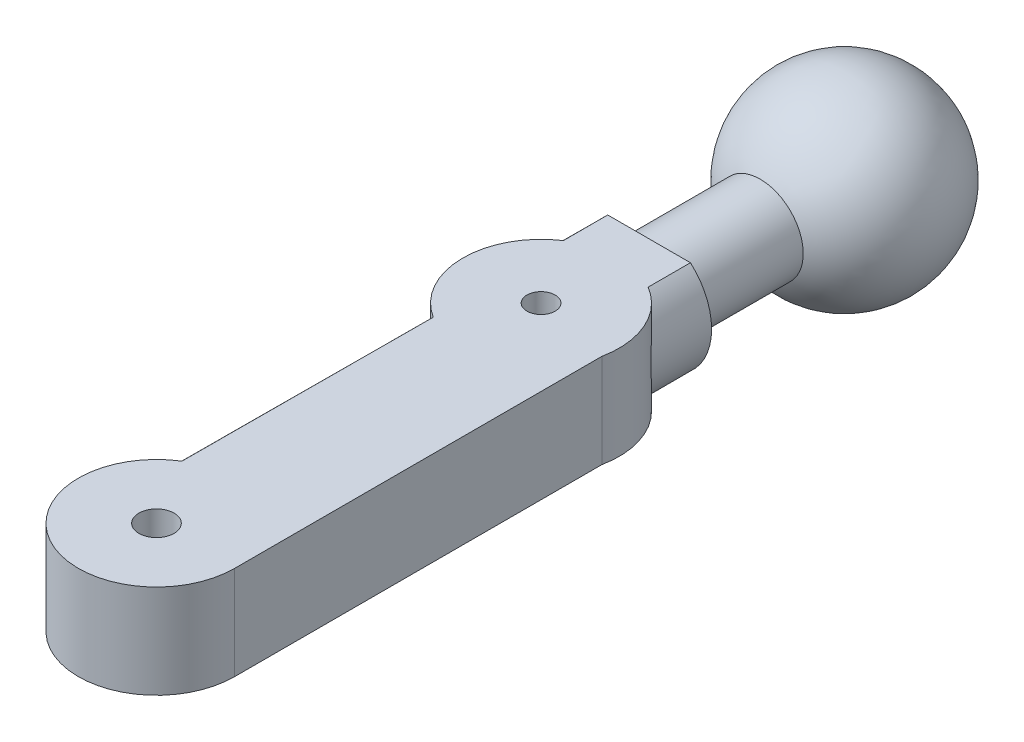
ISO-10303-21;
HEADER;
FILE_DESCRIPTION(('STEP AP214'),'2;1');
FILE_NAME('part.step','',(''),(''),'','','');
FILE_SCHEMA(('AUTOMOTIVE_DESIGN { 1 0 10303 214 1 1 1 1 }'));
ENDSEC;
DATA;
#1=APPLICATION_CONTEXT('core data for automotive mechanical design processes');
#2=APPLICATION_PROTOCOL_DEFINITION('international standard','automotive_design',2000,#1);
#3=PRODUCT_CONTEXT('',#1,'mechanical');
#4=PRODUCT('Part','Part','',(#3));
#5=PRODUCT_RELATED_PRODUCT_CATEGORY('part','',(#4));
#6=PRODUCT_DEFINITION_FORMATION('','',#4);
#7=PRODUCT_DEFINITION_CONTEXT('part definition',#1,'design');
#8=PRODUCT_DEFINITION('design','',#6,#7);
#9=PRODUCT_DEFINITION_SHAPE('','',#8);
#10=(LENGTH_UNIT() NAMED_UNIT(*) SI_UNIT(.MILLI.,.METRE.));
#11=(NAMED_UNIT(*) PLANE_ANGLE_UNIT() SI_UNIT($,.RADIAN.));
#12=(NAMED_UNIT(*) SI_UNIT($,.STERADIAN.) SOLID_ANGLE_UNIT());
#13=UNCERTAINTY_MEASURE_WITH_UNIT(LENGTH_MEASURE(1.E-05),#10,'distance_accuracy_value','');
#14=(GEOMETRIC_REPRESENTATION_CONTEXT(3) GLOBAL_UNCERTAINTY_ASSIGNED_CONTEXT((#13)) GLOBAL_UNIT_ASSIGNED_CONTEXT((#10,
#11,#12)) REPRESENTATION_CONTEXT('',''));
#15=CARTESIAN_POINT('',(0.,0.,0.));
#16=DIRECTION('',(0.,0.,1.));
#17=DIRECTION('',(1.,0.,0.));
#18=AXIS2_PLACEMENT_3D('',#15,#16,#17);
#19=CARTESIAN_POINT('',(0.,0.,5.));
#20=DIRECTION('',(0.,0.,1.));
#21=DIRECTION('',(1.,0.,0.));
#22=AXIS2_PLACEMENT_3D('',#19,#20,#21);
#23=PLANE('',#22);
#24=CARTESIAN_POINT('',(0.,0.,5.));
#25=DIRECTION('',(0.,0.,1.));
#26=DIRECTION('',(1.,0.,0.));
#27=AXIS2_PLACEMENT_3D('',#24,#25,#26);
#28=CIRCLE('',#27,1.1);
#29=CARTESIAN_POINT('',(1.1,0.,5.));
#30=VERTEX_POINT('',#29);
#31=EDGE_CURVE('E11',#30,#30,#28,.T.);
#32=ORIENTED_EDGE('',*,*,#31,.T.);
#33=EDGE_LOOP('',(#32));
#34=FACE_BOUND('',#33,.T.);
#35=DIRECTION('',(1.,0.,0.));
#36=VECTOR('',#35,1.);
#37=CARTESIAN_POINT('',(0.,-1.2,5.));
#38=LINE('',#37,#36);
#39=CARTESIAN_POINT('',(-1.05830052442584,-1.2,5.));
#40=VERTEX_POINT('',#39);
#41=CARTESIAN_POINT('',(1.05830052442584,-1.2,5.));
#42=VERTEX_POINT('',#41);
#43=EDGE_CURVE('E127',#40,#42,#38,.T.);
#44=ORIENTED_EDGE('',*,*,#43,.F.);
#45=CARTESIAN_POINT('',(0.,0.,5.));
#46=DIRECTION('',(0.,0.,1.));
#47=DIRECTION('',(1.,0.,0.));
#48=AXIS2_PLACEMENT_3D('',#45,#46,#47);
#49=CIRCLE('',#48,1.6);
#50=CARTESIAN_POINT('',(-1.05830052442584,1.2,5.));
#51=VERTEX_POINT('',#50);
#52=EDGE_CURVE('E126',#51,#40,#49,.T.);
#53=ORIENTED_EDGE('',*,*,#52,.F.);
#54=DIRECTION('',(-1.,0.,0.));
#55=VECTOR('',#54,1.);
#56=CARTESIAN_POINT('',(0.,1.2,5.));
#57=LINE('',#56,#55);
#58=CARTESIAN_POINT('',(1.05830052442584,1.2,5.));
#59=VERTEX_POINT('',#58);
#60=EDGE_CURVE('E165',#59,#51,#57,.T.);
#61=ORIENTED_EDGE('',*,*,#60,.F.);
#62=EDGE_CURVE('E135',#42,#59,#49,.T.);
#63=ORIENTED_EDGE('',*,*,#62,.F.);
#64=EDGE_LOOP('',(#44,#53,#61,#63));
#65=FACE_BOUND('',#64,.T.);
#66=ADVANCED_FACE('F39',(#34,#65),#23,.F.);
#67=CARTESIAN_POINT('',(0.,0.,19.6074));
#68=DIRECTION('',(0.,0.,-1.));
#69=DIRECTION('',(-1.,0.,0.));
#70=AXIS2_PLACEMENT_3D('',#67,#68,#69);
#71=CYLINDRICAL_SURFACE('',#70,1.6);
#72=DIRECTION('',(0.,0.,-1.));
#73=VECTOR('',#72,1.);
#74=CARTESIAN_POINT('',(-1.05830052442584,-1.2,19.6074));
#75=LINE('',#74,#73);
#76=CARTESIAN_POINT('',(-1.05830052442584,-1.2,6.13572914905545));
#77=VERTEX_POINT('',#76);
#78=EDGE_CURVE('E110',#77,#40,#75,.T.);
#79=ORIENTED_EDGE('',*,*,#78,.F.);
#80=CARTESIAN_POINT('',(-1.6,0.,6.66326472841896));
#81=CARTESIAN_POINT('',(-1.59999540806831,0.0578416875958023,6.66325339853215));
#82=CARTESIAN_POINT('',(-1.59682583072748,0.115771893143185,6.65866743152452));
#83=CARTESIAN_POINT('',(-1.58446465615956,0.229758128386676,6.64123682602176));
#84=CARTESIAN_POINT('',(-1.57525444191099,0.285807799159618,6.6283666582097));
#85=CARTESIAN_POINT('',(-1.54712912949773,0.41501109035429,6.59058540651843));
#86=CARTESIAN_POINT('',(-1.52588743540104,0.486847909173701,6.56298401937582));
#87=CARTESIAN_POINT('',(-1.47492479152338,0.624514381114111,6.50133103951911));
#88=CARTESIAN_POINT('',(-1.44517710742806,0.690324216559001,6.46725922548283));
#89=CARTESIAN_POINT('',(-1.36381794328009,0.84279662286555,6.3812987076754));
#90=CARTESIAN_POINT('',(-1.30827663489573,0.9265489404939,6.32795590412097));
#91=CARTESIAN_POINT('',(-1.18237766592452,1.08259047625911,6.22218483684285));
#92=CARTESIAN_POINT('',(-1.11203165783407,1.15488863176442,6.16975588877709));
#93=CARTESIAN_POINT('',(-0.971968494120657,1.27355774347829,6.08042900158286));
#94=CARTESIAN_POINT('',(-0.904863125430892,1.32223000593018,6.0425072325454));
#95=CARTESIAN_POINT('',(-0.761573011145985,1.40961747756995,5.972879237513));
#96=CARTESIAN_POINT('',(-0.685403221774382,1.44834876482944,5.94116299499322));
#97=CARTESIAN_POINT('',(-0.53884793599359,1.50824180419398,5.89111399638668));
#98=CARTESIAN_POINT('',(-0.469696843765408,1.53127460065516,5.87142055112238));
#99=CARTESIAN_POINT('',(-0.327292615737841,1.56788783687238,5.83934668223212));
#100=CARTESIAN_POINT('',(-0.254041820774121,1.58147361235199,5.82696213110607));
#101=CARTESIAN_POINT('',(-0.105120269725406,1.59830667198868,5.81042334825743));
#102=CARTESIAN_POINT('',(-0.0294409784652014,1.60151222894944,5.80630236022962));
#103=CARTESIAN_POINT('',(0.121583779909635,1.59716088723728,5.80668219707133));
#104=CARTESIAN_POINT('',(0.196929256673978,1.58960430173326,5.81118277106227));
#105=CARTESIAN_POINT('',(0.34006924530483,1.56502008720215,5.82773718501539));
#106=CARTESIAN_POINT('',(0.408036881887384,1.54863696114191,5.83928341574663));
#107=CARTESIAN_POINT('',(0.54003839080499,1.50769307328892,5.86855256852563));
#108=CARTESIAN_POINT('',(0.604071318537238,1.48313035684255,5.88627696700003));
#109=CARTESIAN_POINT('',(0.732413580314463,1.42441877010104,5.92846520313256));
#110=CARTESIAN_POINT('',(0.796281034117762,1.38963115039512,5.95337479295358));
#111=CARTESIAN_POINT('',(0.917454881031658,1.3127953926723,6.00750674151594));
#112=CARTESIAN_POINT('',(0.974757808164351,1.27074344831088,6.03673136006419));
#113=CARTESIAN_POINT('',(1.09319195541994,1.1713418260453,6.10398618886562));
#114=CARTESIAN_POINT('',(1.15282451418338,1.11261254196937,6.14261268789476));
#115=CARTESIAN_POINT('',(1.26204161544891,0.987011615508709,6.22102049780208));
#116=CARTESIAN_POINT('',(1.3116134085405,0.920129811508429,6.26080320182222));
#117=CARTESIAN_POINT('',(1.39726855160461,0.783392995639265,6.33554258707513));
#118=CARTESIAN_POINT('',(1.43403959706584,0.71404888937727,6.37064350841993));
#119=CARTESIAN_POINT('',(1.49767940574636,0.568535917328687,6.43525312490722));
#120=CARTESIAN_POINT('',(1.52456951638817,0.492382211664654,6.46477380810792));
#121=CARTESIAN_POINT('',(1.56083910300081,0.356629943684402,6.50618825800644));
#122=CARTESIAN_POINT('',(1.5730331851649,0.298606286840855,6.52071058412234));
#123=CARTESIAN_POINT('',(1.59093358299406,0.180261490633885,6.54234029055634));
#124=CARTESIAN_POINT('',(1.59665348563355,0.119945438359352,6.54946319700113));
#125=CARTESIAN_POINT('',(1.60115978097552,-0.00166462021216794,6.55505680384763));
#126=CARTESIAN_POINT('',(1.59991253634652,-0.0629619437703156,6.55348552915744));
#127=CARTESIAN_POINT('',(1.59052490901327,-0.184240284747449,6.54190055275375));
#128=CARTESIAN_POINT('',(1.58237476585006,-0.244219314880125,6.53187489692627));
#129=CARTESIAN_POINT('',(1.55682194406013,-0.376823848780874,6.5015278997666));
#130=CARTESIAN_POINT('',(1.53754501692464,-0.44860921564642,6.47918763820698));
#131=CARTESIAN_POINT('',(1.49032607947295,-0.586763558948238,6.42778488152352));
#132=CARTESIAN_POINT('',(1.46235783831086,-0.653115360167239,6.39870210553435));
#133=CARTESIAN_POINT('',(1.38619183864824,-0.805152190252203,6.32514395953967));
#134=CARTESIAN_POINT('',(1.33436013426286,-0.888252924174509,6.27909621175976));
#135=CARTESIAN_POINT('',(1.21668887889522,-1.04362412599953,6.18676738329319));
#136=CARTESIAN_POINT('',(1.1508518253568,-1.11589652090847,6.14048634564156));
#137=CARTESIAN_POINT('',(1.01651933818529,-1.23840333349637,6.05901120910463));
#138=CARTESIAN_POINT('',(0.949937408005803,-1.2903176884756,6.0231996475398));
#139=CARTESIAN_POINT('',(0.807393791180023,-1.38396485699896,5.95747266403162));
#140=CARTESIAN_POINT('',(0.731448207081896,-1.42571479219732,5.92754734346262));
#141=CARTESIAN_POINT('',(0.585347499978542,-1.49083852759616,5.88072480267352));
#142=CARTESIAN_POINT('',(0.516496679056816,-1.51614806643423,5.86246514147058));
#143=CARTESIAN_POINT('',(0.374536535948222,-1.55729622663656,5.83315730354835));
#144=CARTESIAN_POINT('',(0.301429676075186,-1.57314026562738,5.82210500132848));
#145=CARTESIAN_POINT('',(0.152620874938417,-1.59448315964688,5.80819788338981));
#146=CARTESIAN_POINT('',(0.0769095393938157,-1.59993942032936,5.80537679412369));
#147=CARTESIAN_POINT('',(-0.0743470228766033,-1.60005955368652,5.80838601158663));
#148=CARTESIAN_POINT('',(-0.149892258122524,-1.59472399349712,5.8142158636838));
#149=CARTESIAN_POINT('',(-0.29346871480775,-1.57441694941998,5.83341704187208));
#150=CARTESIAN_POINT('',(-0.361666857494179,-1.56010437764613,5.8462654774118));
#151=CARTESIAN_POINT('',(-0.494252219676503,-1.5233032398434,5.8782466075582));
#152=CARTESIAN_POINT('',(-0.558638427745482,-1.50081251509666,5.89738096127664));
#153=CARTESIAN_POINT('',(-0.68773912163524,-1.44648713388859,5.94263752383795));
#154=CARTESIAN_POINT('',(-0.752029325591755,-1.41402758584933,5.96921081612453));
#155=CARTESIAN_POINT('',(-0.874192475588763,-1.34194822304664,6.02690663521576));
#156=CARTESIAN_POINT('',(-0.93206280711443,-1.30232550820762,6.05803100358715));
#157=CARTESIAN_POINT('',(-1.05218633165333,-1.20824310600005,6.12997874547842));
#158=CARTESIAN_POINT('',(-1.1129449461408,-1.15240429435694,6.17148848656591));
#159=CARTESIAN_POINT('',(-1.22473212860955,-1.0328338919417,6.25641224250604));
#160=CARTESIAN_POINT('',(-1.27574533852395,-0.969090099944572,6.29982913261289));
#161=CARTESIAN_POINT('',(-1.36759011055031,-0.834455782155869,6.38534474875444));
#162=CARTESIAN_POINT('',(-1.40847195777136,-0.763603109031948,6.42744903962324));
#163=CARTESIAN_POINT('',(-1.4797628186707,-0.614112373241927,6.50650982487599));
#164=CARTESIAN_POINT('',(-1.51019235985967,-0.535489965537461,6.54347632343668));
#165=CARTESIAN_POINT('',(-1.55033618024275,-0.399442426326389,6.59481038647741));
#166=CARTESIAN_POINT('',(-1.56357070201657,-0.344351408088864,6.61254699828389));
#167=CARTESIAN_POINT('',(-1.58421330585009,-0.231370792988611,6.64079597306771));
#168=CARTESIAN_POINT('',(-1.59164412841011,-0.173493071960397,6.65133651159033));
#169=CARTESIAN_POINT('',(-1.59723779799741,-0.0959175262999869,6.65930830204172));
#170=CARTESIAN_POINT('',(-1.59827152846962,-0.0767835734358768,6.66078677067772));
#171=CARTESIAN_POINT('',(-1.59965348144134,-0.0384363521552226,6.66276699325871));
#172=CARTESIAN_POINT('',(-1.60000152607924,-0.01922306445462,6.66326849378532));
#173=CARTESIAN_POINT('',(-1.6,0.,6.66326472841896));
#174=B_SPLINE_CURVE_WITH_KNOTS('',3,(#80,#81,#82,#83,#84,#85,#86,#87,#88,#89,#90,#91,#92,#93,
#94,#95,#96,#97,#98,#99,#100,#101,#102,#103,#104,#105,#106,#107,#108,#109,#110,#111,#112,#113,
#114,#115,#116,#117,#118,#119,#120,#121,#122,#123,#124,#125,#126,#127,#128,#129,#130,#131,#132,
#133,#134,#135,#136,#137,#138,#139,#140,#141,#142,#143,#144,#145,#146,#147,#148,#149,#150,#151,
#152,#153,#154,#155,#156,#157,#158,#159,#160,#161,#162,#163,#164,#165,#166,#167,#168,#169,#170,
#171,#172,#173),.UNSPECIFIED.,.T.,.F.,(4,2,2,2,2,2,2,2,2,2,2,2,2,2,2,2,2,2,2,2,2,2,2,2,2,2,2,2,
2,2,2,2,2,2,2,2,2,2,2,2,2,2,2,2,2,2,4),(0.,0.173440230674266,0.347417525605232,
0.585566472398366,0.824472307180467,1.16413045576534,1.50352225908876,1.77598359151637,
2.0480014406171,2.27355477550706,2.49898061307016,2.72531151698545,2.9516358350048,
3.16331493568636,3.37504465706752,3.60482594034598,3.83472799114363,4.11027426457565,
4.38616757061209,4.64331234152768,4.89989824728811,5.08234102808173,5.26440021302553,
5.44733913561308,5.63053716015562,5.8620850855164,6.09433873538669,6.41740111684282,
6.74040593780368,7.01448052424715,7.28809019562467,7.51392625485555,7.73963293153412,
7.96626312567005,8.19288141015848,8.40454947489216,8.61627345246118,8.84573267885861,
9.0752850128818,9.35143071619185,9.62800807901808,9.9031838973494,10.1778161599316,
10.3553458165341,10.5321763235104,10.589802378044,10.647443378365),.UNSPECIFIED.);
#175=CARTESIAN_POINT('',(-1.05830052442584,1.2,6.13572914905545));
#176=VERTEX_POINT('',#175);
#177=EDGE_CURVE('E123',#77,#176,#174,.T.);
#178=ORIENTED_EDGE('',*,*,#177,.T.);
#179=DIRECTION('',(0.,0.,-1.));
#180=VECTOR('',#179,1.);
#181=CARTESIAN_POINT('',(-1.05830052442584,1.2,19.6074));
#182=LINE('',#181,#180);
#183=EDGE_CURVE('E54',#51,#176,#182,.F.);
#184=ORIENTED_EDGE('',*,*,#183,.F.);
#185=ORIENTED_EDGE('',*,*,#52,.T.);
#186=EDGE_LOOP('',(#79,#178,#184,#185));
#187=FACE_BOUND('',#186,.T.);
#188=ADVANCED_FACE('F122',(#187),#71,.T.);
#189=DIRECTION('',(0.,0.,-1.));
#190=VECTOR('',#189,1.);
#191=CARTESIAN_POINT('',(1.05830052442584,-1.2,19.6074));
#192=LINE('',#191,#190);
#193=CARTESIAN_POINT('',(1.05830052442584,-1.2,6.08450995339535));
#194=VERTEX_POINT('',#193);
#195=EDGE_CURVE('E160',#42,#194,#192,.F.);
#196=ORIENTED_EDGE('',*,*,#195,.F.);
#197=ORIENTED_EDGE('',*,*,#62,.T.);
#198=DIRECTION('',(0.,0.,-1.));
#199=VECTOR('',#198,1.);
#200=CARTESIAN_POINT('',(1.05830052442584,1.2,19.6074));
#201=LINE('',#200,#199);
#202=CARTESIAN_POINT('',(1.05830052442584,1.2,6.08450995339535));
#203=VERTEX_POINT('',#202);
#204=EDGE_CURVE('E166',#203,#59,#201,.T.);
#205=ORIENTED_EDGE('',*,*,#204,.F.);
#206=EDGE_CURVE('E131',#203,#194,#174,.T.);
#207=ORIENTED_EDGE('',*,*,#206,.T.);
#208=EDGE_LOOP('',(#196,#197,#205,#207));
#209=FACE_BOUND('',#208,.T.);
#210=ADVANCED_FACE('F154',(#209),#71,.T.);
#211=CARTESIAN_POINT('',(0.,0.,17.6064));
#212=DIRECTION('',(0.,0.,-1.));
#213=DIRECTION('',(-1.,0.,0.));
#214=AXIS2_PLACEMENT_3D('',#211,#212,#213);
#215=CYLINDRICAL_SURFACE('',#214,1.1);
#216=CARTESIAN_POINT('',(0.,0.,2.1555509736492));
#217=DIRECTION('',(0.,0.,-1.));
#218=DIRECTION('',(-1.,0.,0.));
#219=AXIS2_PLACEMENT_3D('',#216,#217,#218);
#220=CIRCLE('',#219,1.1);
#221=CARTESIAN_POINT('',(-1.1,0.,2.1555509736492));
#222=VERTEX_POINT('',#221);
#223=EDGE_CURVE('E47',#222,#222,#220,.T.);
#224=ORIENTED_EDGE('',*,*,#223,.F.);
#225=EDGE_LOOP('',(#224));
#226=FACE_BOUND('',#225,.T.);
#227=ORIENTED_EDGE('',*,*,#31,.F.);
#228=EDGE_LOOP('',(#227));
#229=FACE_BOUND('',#228,.T.);
#230=ADVANCED_FACE('F239',(#226,#229),#215,.T.);
#231=CARTESIAN_POINT('',(0.,0.,0.));
#232=DIRECTION('',(0.,1.,0.));
#233=DIRECTION('',(1.,0.,0.));
#234=AXIS2_PLACEMENT_3D('',#231,#232,#233);
#235=SPHERICAL_SURFACE('',#234,2.42);
#236=CARTESIAN_POINT('',(0.,0.,0.));
#237=DIRECTION('',(0.,0.,-1.));
#238=DIRECTION('',(-1.,0.,0.));
#239=AXIS2_PLACEMENT_3D('',#236,#237,#238);
#240=SPHERICAL_SURFACE('',#239,2.42);
#241=ORIENTED_EDGE('',*,*,#223,.T.);
#242=EDGE_LOOP('',(#241));
#243=FACE_BOUND('',#242,.T.);
#244=ADVANCED_FACE('F41',(#243),#240,.T.);
#245=CARTESIAN_POINT('',(0.0410500239629581,-6.85685424949238,7.80648597509485));
#246=DIRECTION('',(0.,1.,0.));
#247=DIRECTION('',(0.,0.,1.));
#248=AXIS2_PLACEMENT_3D('',#245,#246,#247);
#249=CYLINDRICAL_SURFACE('',#248,0.359999999999999);
#250=CARTESIAN_POINT('',(0.0410500239629581,-1.2,7.80648597509485));
#251=DIRECTION('',(0.,1.,0.));
#252=DIRECTION('',(0.,0.,1.));
#253=AXIS2_PLACEMENT_3D('',#250,#251,#252);
#254=CIRCLE('',#253,0.359999999999999);
#255=CARTESIAN_POINT('',(0.0410500239629581,-1.2,8.16648597509485));
#256=VERTEX_POINT('',#255);
#257=EDGE_CURVE('E258',#256,#256,#254,.F.);
#258=ORIENTED_EDGE('',*,*,#257,.T.);
#259=EDGE_LOOP('',(#258));
#260=FACE_BOUND('',#259,.T.);
#261=CARTESIAN_POINT('',(0.0410500239629581,1.2,7.80648597509485));
#262=DIRECTION('',(0.,1.,0.));
#263=DIRECTION('',(0.,0.,1.));
#264=AXIS2_PLACEMENT_3D('',#261,#262,#263);
#265=CIRCLE('',#264,0.359999999999999);
#266=CARTESIAN_POINT('',(0.0410500239629581,1.2,8.16648597509485));
#267=VERTEX_POINT('',#266);
#268=EDGE_CURVE('E261',#267,#267,#265,.T.);
#269=ORIENTED_EDGE('',*,*,#268,.T.);
#270=EDGE_LOOP('',(#269));
#271=FACE_BOUND('',#270,.T.);
#272=ADVANCED_FACE('F229',(#260,#271),#249,.F.);
#273=CARTESIAN_POINT('',(0.,1.2,17.6064));
#274=DIRECTION('',(0.,-1.,0.));
#275=DIRECTION('',(0.,0.,-1.));
#276=AXIS2_PLACEMENT_3D('',#273,#274,#275);
#277=CYLINDRICAL_SURFACE('',#276,0.45);
#278=CARTESIAN_POINT('',(0.,1.2,17.6064));
#279=DIRECTION('',(0.,1.,0.));
#280=DIRECTION('',(0.,0.,1.));
#281=AXIS2_PLACEMENT_3D('',#278,#279,#280);
#282=CIRCLE('',#281,0.45);
#283=CARTESIAN_POINT('',(0.,1.2,18.0564));
#284=VERTEX_POINT('',#283);
#285=EDGE_CURVE('E252',#284,#284,#282,.T.);
#286=ORIENTED_EDGE('',*,*,#285,.T.);
#287=EDGE_LOOP('',(#286));
#288=FACE_BOUND('',#287,.T.);
#289=CARTESIAN_POINT('',(0.,-1.2,17.6064));
#290=DIRECTION('',(0.,1.,0.));
#291=DIRECTION('',(0.,0.,1.));
#292=AXIS2_PLACEMENT_3D('',#289,#290,#291);
#293=CIRCLE('',#292,0.45);
#294=CARTESIAN_POINT('',(0.,-1.2,18.0564));
#295=VERTEX_POINT('',#294);
#296=EDGE_CURVE('E117',#295,#295,#293,.T.);
#297=ORIENTED_EDGE('',*,*,#296,.F.);
#298=EDGE_LOOP('',(#297));
#299=FACE_BOUND('',#298,.T.);
#300=ADVANCED_FACE('F223',(#288,#299),#277,.F.);
#301=CARTESIAN_POINT('',(0.,1.2,17.6064));
#302=DIRECTION('',(0.,-1.,0.));
#303=DIRECTION('',(0.,0.,-1.));
#304=AXIS2_PLACEMENT_3D('',#301,#302,#303);
#305=CYLINDRICAL_SURFACE('',#304,2.);
#306=DIRECTION('',(0.,-1.,0.));
#307=VECTOR('',#306,1.);
#308=CARTESIAN_POINT('',(2.,1.2,17.6064));
#309=LINE('',#308,#307);
#310=CARTESIAN_POINT('',(2.,-1.2,17.6063999999769));
#311=VERTEX_POINT('',#310);
#312=CARTESIAN_POINT('',(2.,1.2,17.6064));
#313=VERTEX_POINT('',#312);
#314=EDGE_CURVE('E134',#311,#313,#309,.F.);
#315=ORIENTED_EDGE('',*,*,#314,.T.);
#316=CARTESIAN_POINT('',(0.,1.2,17.6064));
#317=DIRECTION('',(0.,1.,0.));
#318=DIRECTION('',(0.,0.,1.));
#319=AXIS2_PLACEMENT_3D('',#316,#317,#318);
#320=CIRCLE('',#319,2.);
#321=CARTESIAN_POINT('',(-1.05118264807513,1.2,15.9049256274672));
#322=VERTEX_POINT('',#321);
#323=EDGE_CURVE('E62',#322,#313,#320,.T.);
#324=ORIENTED_EDGE('',*,*,#323,.F.);
#325=CARTESIAN_POINT('',(-1.05118264807513,-1.2,15.9049256274672));
#326=CARTESIAN_POINT('',(-1.08771256692541,-1.16785178363587,15.9274875752077));
#327=CARTESIAN_POINT('',(-1.12257302164182,-1.13425768051888,15.9506560564848));
#328=CARTESIAN_POINT('',(-1.18894064726687,-1.06428628073891,15.9976524742412));
#329=CARTESIAN_POINT('',(-1.22044607102557,-1.0279075507511,16.0214807462507));
#330=CARTESIAN_POINT('',(-1.28040344339868,-0.952063675539898,16.0695005665008));
#331=CARTESIAN_POINT('',(-1.30881492048191,-0.912567144488349,16.093693080732));
#332=CARTESIAN_POINT('',(-1.36206804698796,-0.830914456895135,16.1414594949439));
#333=CARTESIAN_POINT('',(-1.38691103502277,-0.788759306239565,16.1650336241665));
#334=CARTESIAN_POINT('',(-1.44219458613383,-0.684176058278353,16.2199886841439));
#335=CARTESIAN_POINT('',(-1.47085657260519,-0.620424030133441,16.2506873577348));
#336=CARTESIAN_POINT('',(-1.52008250970158,-0.487622395696953,16.3061225451427));
#337=CARTESIAN_POINT('',(-1.54068038360973,-0.418596473728678,16.3308838613097));
#338=CARTESIAN_POINT('',(-1.56871843136114,-0.293073226397905,16.3656345453171));
#339=CARTESIAN_POINT('',(-1.57814280253234,-0.237628679188641,16.3777541078544));
#340=CARTESIAN_POINT('',(-1.59105198356153,-0.124973458620244,16.3945122650878));
#341=CARTESIAN_POINT('',(-1.59454721331859,-0.0677660638819965,16.3991639830334));
#342=CARTESIAN_POINT('',(-1.59530334348981,0.046916006927647,16.4001627046547));
#343=CARTESIAN_POINT('',(-1.59254809511031,0.104390991604299,16.3964881966436));
#344=CARTESIAN_POINT('',(-1.58102578141267,0.217738887738839,16.3814752937199));
#345=CARTESIAN_POINT('',(-1.57224880434559,0.273608999374247,16.3701242637136));
#346=CARTESIAN_POINT('',(-1.54511059650353,0.402475321229886,16.3362619869184));
#347=CARTESIAN_POINT('',(-1.52442136040931,0.47428621052454,16.3111903476318));
#348=CARTESIAN_POINT('',(-1.47437899172324,0.612327728325455,16.2544986950295));
#349=CARTESIAN_POINT('',(-1.44498161976333,0.678527587439644,16.2228454967397));
#350=CARTESIAN_POINT('',(-1.38862456152462,0.785761392131721,16.1666805594515));
#351=CARTESIAN_POINT('',(-1.36367603530377,0.828293033206258,16.1429509044668));
#352=CARTESIAN_POINT('',(-1.31015618396478,0.910658226487194,16.0948497219222));
#353=CARTESIAN_POINT('',(-1.28158354407272,0.95049079142284,16.0704779639722));
#354=CARTESIAN_POINT('',(-1.22131104743601,1.02688989456951,16.0221427228171));
#355=CARTESIAN_POINT('',(-1.18965892595652,1.06349343874817,15.9981781896887));
#356=CARTESIAN_POINT('',(-1.1229602770885,1.13388420962218,15.9509134262582));
#357=CARTESIAN_POINT('',(-1.08791552469431,1.1676728919949,15.9276128567477));
#358=CARTESIAN_POINT('',(-1.05118264807513,1.2,15.9049256274672));
#359=B_SPLINE_CURVE_WITH_KNOTS('',3,(#325,#326,#327,#328,#329,#330,#331,#332,#333,#334,#335,
#336,#337,#338,#339,#340,#341,#342,#343,#344,#345,#346,#347,#348,#349,#350,#351,#352,#353,#354,
#355,#356,#357,#358),.UNSPECIFIED.,.F.,.F.,(4,2,2,2,2,2,2,2,2,2,2,2,2,2,2,2,4),(0.,
0.160841637393691,0.321766628482963,0.484592810512403,0.647357752760079,0.875713294056056,
1.10309761670439,1.27499770950655,1.44659539015841,1.61863691693293,1.79096230512333,
2.02613581258674,2.26252516774273,2.42651194217207,2.59055837961331,2.75237713380878,
2.91411167877112),.UNSPECIFIED.);
#360=CARTESIAN_POINT('',(-1.05118264807513,-1.2,15.9049256274672));
#361=VERTEX_POINT('',#360);
#362=EDGE_CURVE('E186',#361,#322,#359,.T.);
#363=ORIENTED_EDGE('',*,*,#362,.F.);
#364=CARTESIAN_POINT('',(0.,-1.2,17.6064));
#365=DIRECTION('',(0.,1.,0.));
#366=DIRECTION('',(0.,0.,1.));
#367=AXIS2_PLACEMENT_3D('',#364,#365,#366);
#368=CIRCLE('',#367,2.);
#369=EDGE_CURVE('E249',#361,#311,#368,.T.);
#370=ORIENTED_EDGE('',*,*,#369,.T.);
#371=EDGE_LOOP('',(#315,#324,#363,#370));
#372=FACE_BOUND('',#371,.T.);
#373=ADVANCED_FACE('F217',(#372),#305,.T.);
#374=CARTESIAN_POINT('',(0.0839320741856862,0.,-2.4307895444913));
#375=DIRECTION('',(-0.00418877795540379,0.,0.999991227031138));
#376=DIRECTION('',(0.999991227031138,0.,0.00418877795540379));
#377=AXIS2_PLACEMENT_3D('',#374,#375,#376);
#378=CYLINDRICAL_SURFACE('',#377,1.6);
#379=DIRECTION('',(-0.00418877795540379,0.,0.999991227031138));
#380=VECTOR('',#379,1.);
#381=CARTESIAN_POINT('',(-0.974359165802603,1.2,-2.43522253039821));
#382=LINE('',#381,#380);
#383=CARTESIAN_POINT('',(-1.02434980793849,1.2,9.4990943758138));
#384=VERTEX_POINT('',#383);
#385=EDGE_CURVE('E189',#384,#322,#382,.T.);
#386=ORIENTED_EDGE('',*,*,#385,.F.);
#387=CARTESIAN_POINT('',(-1.02434980793849,1.2,9.4990943758138));
#388=CARTESIAN_POINT('',(-1.06068943257059,1.16785178363587,9.47622719105814));
#389=CARTESIAN_POINT('',(-1.09535457042917,1.13425768051888,9.45276747995659));
#390=CARTESIAN_POINT('',(-1.16132615543667,1.06428628073891,9.4052167177688));
#391=CARTESIAN_POINT('',(-1.19263085268608,1.0279075507511,9.38112534580087));
#392=CARTESIAN_POINT('',(-1.25218383585207,0.952063675539899,9.33260491881623));
#393=CARTESIAN_POINT('',(-1.28039164356511,0.91256714448835,9.30817523689236));
#394=CARTESIAN_POINT('',(-1.3332427390322,0.830914456895135,9.25996437175533));
#395=CARTESIAN_POINT('',(-1.35788736343078,0.788759306239565,9.23618294809409));
#396=CARTESIAN_POINT('',(-1.41270858949831,0.684176058278354,9.1807666796071));
#397=CARTESIAN_POINT('',(-1.44111239257305,0.620424030133441,9.14982896799786));
#398=CARTESIAN_POINT('',(-1.4898721949389,0.487622395696953,9.0939833364838));
#399=CARTESIAN_POINT('',(-1.51026190854143,0.418596473728678,9.0690503309075));
#400=CARTESIAN_POINT('',(-1.5380078491453,0.293073226397905,9.03406597810953));
#401=CARTESIAN_POINT('',(-1.54733035817707,0.237628679188641,9.02186788836475));
#402=CARTESIAN_POINT('',(-1.56009869503335,0.124973458620245,9.00500217276683));
#403=CARTESIAN_POINT('',(-1.56355483245149,0.0677660638819973,9.00032133683219));
#404=CARTESIAN_POINT('',(-1.56430256931598,-0.0469160069276456,8.9993163157906));
#405=CARTESIAN_POINT('',(-1.56157820074913,-0.104390991604298,9.00301377690169));
#406=CARTESIAN_POINT('',(-1.55018206171956,-0.217738887738837,9.01812268097722));
#407=CARTESIAN_POINT('',(-1.54150048570598,-0.273608999374245,9.02954684162739));
#408=CARTESIAN_POINT('',(-1.51464691081873,-0.402475321229883,9.06363527999589));
#409=CARTESIAN_POINT('',(-1.49416843796265,-0.474286210524537,9.08887936318709));
#410=CARTESIAN_POINT('',(-1.44460275867219,-0.612327728325452,9.14598825544541));
#411=CARTESIAN_POINT('',(-1.41547159242871,-0.678527587439641,9.17788661893655));
#412=CARTESIAN_POINT('',(-1.35958703263065,-0.785761392131718,9.23452171556479));
#413=CARTESIAN_POINT('',(-1.33483817666389,-0.828293033206256,9.25845954367477));
#414=CARTESIAN_POINT('',(-1.28172317023951,-0.910658226487192,9.30700739987946));
#415=CARTESIAN_POINT('',(-1.25335570698422,-0.950490791422837,9.3316176693708));
#416=CARTESIAN_POINT('',(-1.19349025304596,-1.02688989456951,9.38045614613972));
#417=CARTESIAN_POINT('',(-1.16204000474876,-1.06349343874817,9.40468500340246));
#418=CARTESIAN_POINT('',(-1.09573965617563,-1.13388420962218,9.45250687498907));
#419=CARTESIAN_POINT('',(-1.06089133367346,-1.1676728919949,9.47610021363933));
#420=CARTESIAN_POINT('',(-1.0243498079385,-1.2,9.49909437581381));
#421=B_SPLINE_CURVE_WITH_KNOTS('',3,(#387,#388,#389,#390,#391,#392,#393,#394,#395,#396,#397,
#398,#399,#400,#401,#402,#403,#404,#405,#406,#407,#408,#409,#410,#411,#412,#413,#414,#415,#416,
#417,#418,#419,#420),.UNSPECIFIED.,.F.,.F.,(4,2,2,2,2,2,2,2,2,2,2,2,2,2,2,2,4),(0.,
0.16084163739369,0.321766628482964,0.484592810512402,0.64735775276008,0.875713294056058,
1.10309761670439,1.27499770950655,1.44659539015841,1.61863691693293,1.79096230512332,
2.02613581258674,2.26252516774273,2.42651194217207,2.5905583796133,2.75237713380878,
2.91411167877112),.UNSPECIFIED.);
#422=CARTESIAN_POINT('',(-1.02434980793849,-1.2,9.4990943758138));
#423=VERTEX_POINT('',#422);
#424=EDGE_CURVE('E198',#384,#423,#421,.T.);
#425=ORIENTED_EDGE('',*,*,#424,.T.);
#426=DIRECTION('',(-0.00418877795540379,0.,0.999991227031138));
#427=VECTOR('',#426,1.);
#428=CARTESIAN_POINT('',(-0.974359165802603,-1.2,-2.43522253039821));
#429=LINE('',#428,#427);
#430=EDGE_CURVE('E113',#423,#361,#429,.T.);
#431=ORIENTED_EDGE('',*,*,#430,.T.);
#432=ORIENTED_EDGE('',*,*,#362,.T.);
#433=EDGE_LOOP('',(#386,#425,#431,#432));
#434=FACE_BOUND('',#433,.T.);
#435=ADVANCED_FACE('F208',(#434),#378,.T.);
#436=CARTESIAN_POINT('',(2.,1.2,-500000.));
#437=DIRECTION('',(1.,0.,0.));
#438=DIRECTION('',(0.,0.,-1.));
#439=AXIS2_PLACEMENT_3D('',#436,#437,#438);
#440=PLANE('',#439);
#441=DIRECTION('',(0.,1.,0.));
#442=VECTOR('',#441,1.);
#443=CARTESIAN_POINT('',(2.,-6.85685424949238,8.20961745660489));
#444=LINE('',#443,#442);
#445=CARTESIAN_POINT('',(2.,1.2,8.20961745660489));
#446=VERTEX_POINT('',#445);
#447=CARTESIAN_POINT('',(2.,-1.2,8.20961745648674));
#448=VERTEX_POINT('',#447);
#449=EDGE_CURVE('E180',#446,#448,#444,.F.);
#450=ORIENTED_EDGE('',*,*,#449,.F.);
#451=DIRECTION('',(0.,0.,1.));
#452=VECTOR('',#451,1.);
#453=CARTESIAN_POINT('',(2.,1.2,-500000.));
#454=LINE('',#453,#452);
#455=EDGE_CURVE('E183',#446,#313,#454,.T.);
#456=ORIENTED_EDGE('',*,*,#455,.T.);
#457=ORIENTED_EDGE('',*,*,#314,.F.);
#458=DIRECTION('',(0.,0.,1.));
#459=VECTOR('',#458,1.);
#460=CARTESIAN_POINT('',(2.,-1.2,-500000.));
#461=LINE('',#460,#459);
#462=EDGE_CURVE('E173',#448,#311,#461,.T.);
#463=ORIENTED_EDGE('',*,*,#462,.F.);
#464=EDGE_LOOP('',(#450,#456,#457,#463));
#465=FACE_BOUND('',#464,.T.);
#466=ADVANCED_FACE('F179',(#465),#440,.T.);
#467=CARTESIAN_POINT('',(0.,-1.2,17.6064));
#468=DIRECTION('',(0.,1.,0.));
#469=DIRECTION('',(0.,0.,1.));
#470=AXIS2_PLACEMENT_3D('',#467,#468,#469);
#471=PLANE('',#470);
#472=CARTESIAN_POINT('',(0.0410500239629581,-1.2,7.80648597509485));
#473=DIRECTION('',(0.,1.,0.));
#474=DIRECTION('',(0.,0.,1.));
#475=AXIS2_PLACEMENT_3D('',#472,#473,#474);
#476=CIRCLE('',#475,2.);
#477=EDGE_CURVE('E118',#194,#448,#476,.F.);
#478=ORIENTED_EDGE('',*,*,#477,.T.);
#479=ORIENTED_EDGE('',*,*,#462,.T.);
#480=ORIENTED_EDGE('',*,*,#369,.F.);
#481=ORIENTED_EDGE('',*,*,#430,.F.);
#482=EDGE_CURVE('E106',#423,#77,#476,.F.);
#483=ORIENTED_EDGE('',*,*,#482,.T.);
#484=ORIENTED_EDGE('',*,*,#78,.T.);
#485=ORIENTED_EDGE('',*,*,#43,.T.);
#486=ORIENTED_EDGE('',*,*,#195,.T.);
#487=EDGE_LOOP('',(#478,#479,#480,#481,#483,#484,#485,#486));
#488=FACE_BOUND('',#487,.T.);
#489=ORIENTED_EDGE('',*,*,#257,.F.);
#490=EDGE_LOOP('',(#489));
#491=FACE_BOUND('',#490,.T.);
#492=ORIENTED_EDGE('',*,*,#296,.T.);
#493=EDGE_LOOP('',(#492));
#494=FACE_BOUND('',#493,.T.);
#495=ADVANCED_FACE('F108',(#488,#491,#494),#471,.F.);
#496=CARTESIAN_POINT('',(0.,1.2,17.6064));
#497=DIRECTION('',(0.,1.,0.));
#498=DIRECTION('',(0.,0.,1.));
#499=AXIS2_PLACEMENT_3D('',#496,#497,#498);
#500=PLANE('',#499);
#501=ORIENTED_EDGE('',*,*,#268,.F.);
#502=EDGE_LOOP('',(#501));
#503=FACE_BOUND('',#502,.T.);
#504=CARTESIAN_POINT('',(0.0410500239629581,1.2,7.80648597509485));
#505=DIRECTION('',(0.,1.,0.));
#506=DIRECTION('',(0.,0.,1.));
#507=AXIS2_PLACEMENT_3D('',#504,#505,#506);
#508=CIRCLE('',#507,2.);
#509=EDGE_CURVE('E177',#446,#203,#508,.T.);
#510=ORIENTED_EDGE('',*,*,#509,.T.);
#511=ORIENTED_EDGE('',*,*,#204,.T.);
#512=ORIENTED_EDGE('',*,*,#60,.T.);
#513=ORIENTED_EDGE('',*,*,#183,.T.);
#514=EDGE_CURVE('E130',#176,#384,#508,.T.);
#515=ORIENTED_EDGE('',*,*,#514,.T.);
#516=ORIENTED_EDGE('',*,*,#385,.T.);
#517=ORIENTED_EDGE('',*,*,#323,.T.);
#518=ORIENTED_EDGE('',*,*,#455,.F.);
#519=EDGE_LOOP('',(#510,#511,#512,#513,#515,#516,#517,#518));
#520=FACE_BOUND('',#519,.T.);
#521=ORIENTED_EDGE('',*,*,#285,.F.);
#522=EDGE_LOOP('',(#521));
#523=FACE_BOUND('',#522,.T.);
#524=ADVANCED_FACE('F214',(#503,#520,#523),#500,.T.);
#525=CARTESIAN_POINT('',(0.0410500239629581,-6.85685424949238,7.80648597509485));
#526=DIRECTION('',(0.,1.,0.));
#527=DIRECTION('',(0.,0.,1.));
#528=AXIS2_PLACEMENT_3D('',#525,#526,#527);
#529=CYLINDRICAL_SURFACE('',#528,2.);
#530=ORIENTED_EDGE('',*,*,#514,.F.);
#531=ORIENTED_EDGE('',*,*,#177,.F.);
#532=ORIENTED_EDGE('',*,*,#482,.F.);
#533=ORIENTED_EDGE('',*,*,#424,.F.);
#534=EDGE_LOOP('',(#530,#531,#532,#533));
#535=FACE_BOUND('',#534,.T.);
#536=ADVANCED_FACE('F129',(#535),#529,.T.);
#537=ORIENTED_EDGE('',*,*,#477,.F.);
#538=ORIENTED_EDGE('',*,*,#206,.F.);
#539=ORIENTED_EDGE('',*,*,#509,.F.);
#540=ORIENTED_EDGE('',*,*,#449,.T.);
#541=EDGE_LOOP('',(#537,#538,#539,#540));
#542=FACE_BOUND('',#541,.T.);
#543=ADVANCED_FACE('F185',(#542),#529,.T.);
#544=CLOSED_SHELL('',(#66,#188,#210,#230,#244,#272,#300,#373,#435,#466,#495,#524,#536,#543));
#545=MANIFOLD_SOLID_BREP('B2',#544);
#546=ADVANCED_BREP_SHAPE_REPRESENTATION('',(#18,#545),#14);
#547=SHAPE_DEFINITION_REPRESENTATION(#9,#546);
ENDSEC;
END-ISO-10303-21;
